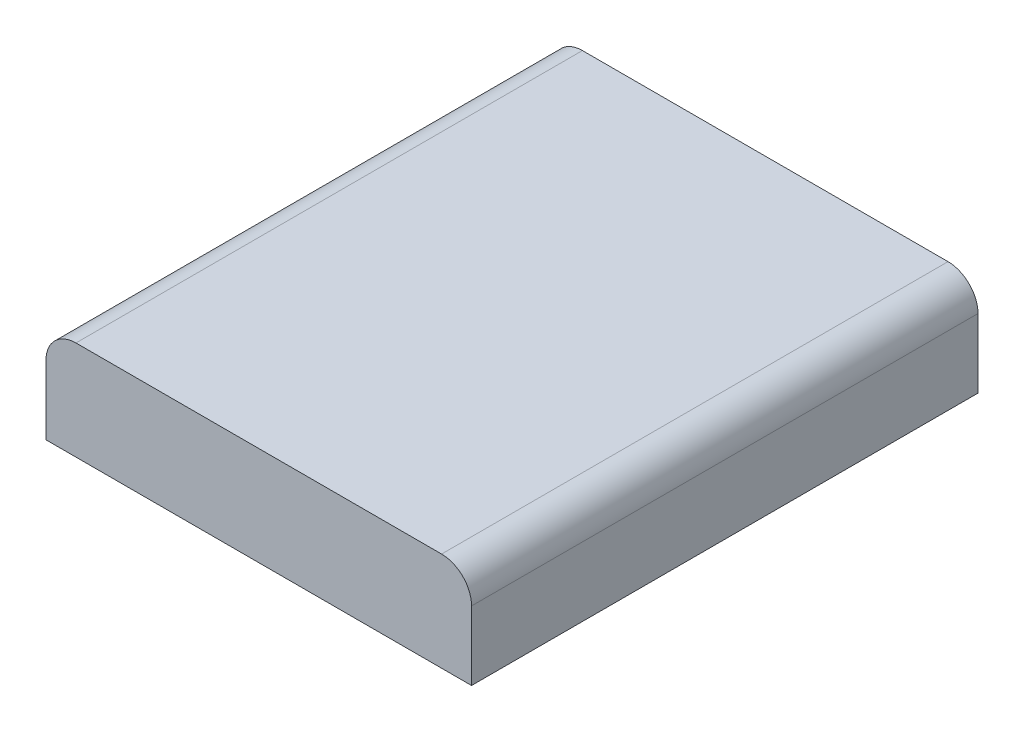
ISO-10303-21;
HEADER;
FILE_DESCRIPTION(('STEP AP214'),'2;1');
FILE_NAME('part.step','',(''),(''),'','','');
FILE_SCHEMA(('AUTOMOTIVE_DESIGN { 1 0 10303 214 1 1 1 1 }'));
ENDSEC;
DATA;
#1=APPLICATION_CONTEXT('core data for automotive mechanical design processes');
#2=APPLICATION_PROTOCOL_DEFINITION('international standard','automotive_design',2000,#1);
#3=PRODUCT_CONTEXT('',#1,'mechanical');
#4=PRODUCT('Part','Part','',(#3));
#5=PRODUCT_RELATED_PRODUCT_CATEGORY('part','',(#4));
#6=PRODUCT_DEFINITION_FORMATION('','',#4);
#7=PRODUCT_DEFINITION_CONTEXT('part definition',#1,'design');
#8=PRODUCT_DEFINITION('design','',#6,#7);
#9=PRODUCT_DEFINITION_SHAPE('','',#8);
#10=(LENGTH_UNIT() NAMED_UNIT(*) SI_UNIT(.MILLI.,.METRE.));
#11=(NAMED_UNIT(*) PLANE_ANGLE_UNIT() SI_UNIT($,.RADIAN.));
#12=(NAMED_UNIT(*) SI_UNIT($,.STERADIAN.) SOLID_ANGLE_UNIT());
#13=UNCERTAINTY_MEASURE_WITH_UNIT(LENGTH_MEASURE(1.E-05),#10,'distance_accuracy_value','');
#14=(GEOMETRIC_REPRESENTATION_CONTEXT(3) GLOBAL_UNCERTAINTY_ASSIGNED_CONTEXT((#13)) GLOBAL_UNIT_ASSIGNED_CONTEXT((#10,
#11,#12)) REPRESENTATION_CONTEXT('',''));
#15=CARTESIAN_POINT('',(0.,0.,0.));
#16=DIRECTION('',(0.,0.,1.));
#17=DIRECTION('',(1.,0.,0.));
#18=AXIS2_PLACEMENT_3D('',#15,#16,#17);
#19=CARTESIAN_POINT('',(0.,0.,169.));
#20=DIRECTION('',(1.,0.,0.));
#21=DIRECTION('',(0.,0.,-1.));
#22=AXIS2_PLACEMENT_3D('',#19,#20,#21);
#23=PLANE('',#22);
#24=DIRECTION('',(0.,-1.,0.));
#25=VECTOR('',#24,1.);
#26=CARTESIAN_POINT('',(0.,0.,0.));
#27=LINE('',#26,#25);
#28=CARTESIAN_POINT('',(0.,22.9999999999999,0.));
#29=VERTEX_POINT('',#28);
#30=CARTESIAN_POINT('',(0.,0.,0.));
#31=VERTEX_POINT('',#30);
#32=EDGE_CURVE('E123',#29,#31,#27,.T.);
#33=ORIENTED_EDGE('',*,*,#32,.T.);
#34=DIRECTION('',(0.,0.,-1.));
#35=VECTOR('',#34,1.);
#36=CARTESIAN_POINT('',(0.,0.,169.));
#37=LINE('',#36,#35);
#38=CARTESIAN_POINT('',(0.,0.,169.));
#39=VERTEX_POINT('',#38);
#40=EDGE_CURVE('E11',#39,#31,#37,.T.);
#41=ORIENTED_EDGE('',*,*,#40,.F.);
#42=DIRECTION('',(0.,-1.,0.));
#43=VECTOR('',#42,1.);
#44=CARTESIAN_POINT('',(0.,0.,169.));
#45=LINE('',#44,#43);
#46=CARTESIAN_POINT('',(0.,22.9999999999999,169.));
#47=VERTEX_POINT('',#46);
#48=EDGE_CURVE('E134',#47,#39,#45,.T.);
#49=ORIENTED_EDGE('',*,*,#48,.F.);
#50=DIRECTION('',(0.,0.,-1.));
#51=VECTOR('',#50,1.);
#52=CARTESIAN_POINT('',(0.,22.9999999999999,169.));
#53=LINE('',#52,#51);
#54=EDGE_CURVE('E122',#47,#29,#53,.T.);
#55=ORIENTED_EDGE('',*,*,#54,.T.);
#56=EDGE_LOOP('',(#33,#41,#49,#55));
#57=FACE_BOUND('',#56,.T.);
#58=ADVANCED_FACE('F41',(#57),#23,.F.);
#59=CARTESIAN_POINT('',(0.,0.,169.));
#60=DIRECTION('',(0.,1.,0.));
#61=DIRECTION('',(0.,0.,1.));
#62=AXIS2_PLACEMENT_3D('',#59,#60,#61);
#63=PLANE('',#62);
#64=DIRECTION('',(1.,0.,0.));
#65=VECTOR('',#64,1.);
#66=CARTESIAN_POINT('',(0.,0.,0.));
#67=LINE('',#66,#65);
#68=CARTESIAN_POINT('',(142.,0.,0.));
#69=VERTEX_POINT('',#68);
#70=EDGE_CURVE('E126',#31,#69,#67,.T.);
#71=ORIENTED_EDGE('',*,*,#70,.T.);
#72=DIRECTION('',(0.,0.,-1.));
#73=VECTOR('',#72,1.);
#74=CARTESIAN_POINT('',(142.,0.,169.));
#75=LINE('',#74,#73);
#76=CARTESIAN_POINT('',(142.,0.,169.));
#77=VERTEX_POINT('',#76);
#78=EDGE_CURVE('E47',#77,#69,#75,.T.);
#79=ORIENTED_EDGE('',*,*,#78,.F.);
#80=DIRECTION('',(1.,0.,0.));
#81=VECTOR('',#80,1.);
#82=CARTESIAN_POINT('',(0.,0.,169.));
#83=LINE('',#82,#81);
#84=EDGE_CURVE('E94',#39,#77,#83,.T.);
#85=ORIENTED_EDGE('',*,*,#84,.F.);
#86=ORIENTED_EDGE('',*,*,#40,.T.);
#87=EDGE_LOOP('',(#71,#79,#85,#86));
#88=FACE_BOUND('',#87,.T.);
#89=ADVANCED_FACE('F157',(#88),#63,.F.);
#90=CARTESIAN_POINT('',(142.,0.,169.));
#91=DIRECTION('',(-1.,0.,0.));
#92=DIRECTION('',(0.,0.,1.));
#93=AXIS2_PLACEMENT_3D('',#90,#91,#92);
#94=PLANE('',#93);
#95=DIRECTION('',(0.,1.,0.));
#96=VECTOR('',#95,1.);
#97=CARTESIAN_POINT('',(142.,0.,0.));
#98=LINE('',#97,#96);
#99=CARTESIAN_POINT('',(142.,22.9999999999999,0.));
#100=VERTEX_POINT('',#99);
#101=EDGE_CURVE('E128',#69,#100,#98,.T.);
#102=ORIENTED_EDGE('',*,*,#101,.T.);
#103=DIRECTION('',(0.,0.,-1.));
#104=VECTOR('',#103,1.);
#105=CARTESIAN_POINT('',(142.,22.9999999999999,169.));
#106=LINE('',#105,#104);
#107=CARTESIAN_POINT('',(142.,22.9999999999999,169.));
#108=VERTEX_POINT('',#107);
#109=EDGE_CURVE('E116',#108,#100,#106,.T.);
#110=ORIENTED_EDGE('',*,*,#109,.F.);
#111=DIRECTION('',(0.,1.,0.));
#112=VECTOR('',#111,1.);
#113=CARTESIAN_POINT('',(142.,0.,169.));
#114=LINE('',#113,#112);
#115=EDGE_CURVE('E110',#77,#108,#114,.T.);
#116=ORIENTED_EDGE('',*,*,#115,.F.);
#117=ORIENTED_EDGE('',*,*,#78,.T.);
#118=EDGE_LOOP('',(#102,#110,#116,#117));
#119=FACE_BOUND('',#118,.T.);
#120=ADVANCED_FACE('F143',(#119),#94,.F.);
#121=CARTESIAN_POINT('',(132.,23.,169.));
#122=DIRECTION('',(0.,0.,-1.));
#123=DIRECTION('',(-1.,0.,0.));
#124=AXIS2_PLACEMENT_3D('',#121,#122,#123);
#125=CYLINDRICAL_SURFACE('',#124,10.);
#126=CARTESIAN_POINT('',(132.,23.,0.));
#127=DIRECTION('',(0.,0.,1.));
#128=DIRECTION('',(1.,0.,0.));
#129=AXIS2_PLACEMENT_3D('',#126,#127,#128);
#130=CIRCLE('',#129,10.);
#131=CARTESIAN_POINT('',(132.,33.,0.));
#132=VERTEX_POINT('',#131);
#133=EDGE_CURVE('E113',#100,#132,#130,.T.);
#134=ORIENTED_EDGE('',*,*,#133,.T.);
#135=DIRECTION('',(0.,0.,-1.));
#136=VECTOR('',#135,1.);
#137=CARTESIAN_POINT('',(132.,33.,169.));
#138=LINE('',#137,#136);
#139=CARTESIAN_POINT('',(132.,33.,169.));
#140=VERTEX_POINT('',#139);
#141=EDGE_CURVE('E115',#140,#132,#138,.T.);
#142=ORIENTED_EDGE('',*,*,#141,.F.);
#143=CARTESIAN_POINT('',(132.,23.,169.));
#144=DIRECTION('',(0.,0.,1.));
#145=DIRECTION('',(1.,0.,0.));
#146=AXIS2_PLACEMENT_3D('',#143,#144,#145);
#147=CIRCLE('',#146,10.);
#148=EDGE_CURVE('E101',#108,#140,#147,.T.);
#149=ORIENTED_EDGE('',*,*,#148,.F.);
#150=ORIENTED_EDGE('',*,*,#109,.T.);
#151=EDGE_LOOP('',(#134,#142,#149,#150));
#152=FACE_BOUND('',#151,.T.);
#153=ADVANCED_FACE('F114',(#152),#125,.T.);
#154=CARTESIAN_POINT('',(10.0000000000001,33.,169.));
#155=DIRECTION('',(0.,-1.,0.));
#156=DIRECTION('',(0.,0.,-1.));
#157=AXIS2_PLACEMENT_3D('',#154,#155,#156);
#158=PLANE('',#157);
#159=DIRECTION('',(-1.,0.,0.));
#160=VECTOR('',#159,1.);
#161=CARTESIAN_POINT('',(10.0000000000001,33.,0.));
#162=LINE('',#161,#160);
#163=CARTESIAN_POINT('',(10.0000000000001,33.,0.));
#164=VERTEX_POINT('',#163);
#165=EDGE_CURVE('E79',#132,#164,#162,.T.);
#166=ORIENTED_EDGE('',*,*,#165,.T.);
#167=DIRECTION('',(0.,0.,-1.));
#168=VECTOR('',#167,1.);
#169=CARTESIAN_POINT('',(10.0000000000001,33.,169.));
#170=LINE('',#169,#168);
#171=CARTESIAN_POINT('',(10.0000000000001,33.,169.));
#172=VERTEX_POINT('',#171);
#173=EDGE_CURVE('E120',#172,#164,#170,.T.);
#174=ORIENTED_EDGE('',*,*,#173,.F.);
#175=DIRECTION('',(-1.,0.,0.));
#176=VECTOR('',#175,1.);
#177=CARTESIAN_POINT('',(10.0000000000001,33.,169.));
#178=LINE('',#177,#176);
#179=EDGE_CURVE('E104',#140,#172,#178,.T.);
#180=ORIENTED_EDGE('',*,*,#179,.F.);
#181=ORIENTED_EDGE('',*,*,#141,.T.);
#182=EDGE_LOOP('',(#166,#174,#180,#181));
#183=FACE_BOUND('',#182,.T.);
#184=ADVANCED_FACE('F118',(#183),#158,.F.);
#185=CARTESIAN_POINT('',(10.,23.,169.));
#186=DIRECTION('',(0.,0.,-1.));
#187=DIRECTION('',(-1.,0.,0.));
#188=AXIS2_PLACEMENT_3D('',#185,#186,#187);
#189=CYLINDRICAL_SURFACE('',#188,10.);
#190=CARTESIAN_POINT('',(10.,23.,0.));
#191=DIRECTION('',(0.,0.,1.));
#192=DIRECTION('',(1.,0.,0.));
#193=AXIS2_PLACEMENT_3D('',#190,#191,#192);
#194=CIRCLE('',#193,10.);
#195=EDGE_CURVE('E88',#164,#29,#194,.T.);
#196=ORIENTED_EDGE('',*,*,#195,.T.);
#197=ORIENTED_EDGE('',*,*,#54,.F.);
#198=CARTESIAN_POINT('',(10.,23.,169.));
#199=DIRECTION('',(0.,0.,1.));
#200=DIRECTION('',(1.,0.,0.));
#201=AXIS2_PLACEMENT_3D('',#198,#199,#200);
#202=CIRCLE('',#201,10.);
#203=EDGE_CURVE('E60',#172,#47,#202,.T.);
#204=ORIENTED_EDGE('',*,*,#203,.F.);
#205=ORIENTED_EDGE('',*,*,#173,.T.);
#206=EDGE_LOOP('',(#196,#197,#204,#205));
#207=FACE_BOUND('',#206,.T.);
#208=ADVANCED_FACE('F146',(#207),#189,.T.);
#209=CARTESIAN_POINT('',(10.,23.,169.));
#210=DIRECTION('',(0.,0.,1.));
#211=DIRECTION('',(1.,0.,0.));
#212=AXIS2_PLACEMENT_3D('',#209,#210,#211);
#213=PLANE('',#212);
#214=ORIENTED_EDGE('',*,*,#48,.T.);
#215=ORIENTED_EDGE('',*,*,#84,.T.);
#216=ORIENTED_EDGE('',*,*,#115,.T.);
#217=ORIENTED_EDGE('',*,*,#148,.T.);
#218=ORIENTED_EDGE('',*,*,#179,.T.);
#219=ORIENTED_EDGE('',*,*,#203,.T.);
#220=EDGE_LOOP('',(#214,#215,#216,#217,#218,#219));
#221=FACE_BOUND('',#220,.T.);
#222=ADVANCED_FACE('F103',(#221),#213,.T.);
#223=CARTESIAN_POINT('',(10.,23.,0.));
#224=DIRECTION('',(0.,0.,1.));
#225=DIRECTION('',(1.,0.,0.));
#226=AXIS2_PLACEMENT_3D('',#223,#224,#225);
#227=PLANE('',#226);
#228=ORIENTED_EDGE('',*,*,#32,.F.);
#229=ORIENTED_EDGE('',*,*,#195,.F.);
#230=ORIENTED_EDGE('',*,*,#165,.F.);
#231=ORIENTED_EDGE('',*,*,#133,.F.);
#232=ORIENTED_EDGE('',*,*,#101,.F.);
#233=ORIENTED_EDGE('',*,*,#70,.F.);
#234=EDGE_LOOP('',(#228,#229,#230,#231,#232,#233));
#235=FACE_BOUND('',#234,.T.);
#236=ADVANCED_FACE('F145',(#235),#227,.F.);
#237=CLOSED_SHELL('',(#58,#89,#120,#153,#184,#208,#222,#236));
#238=MANIFOLD_SOLID_BREP('B2',#237);
#239=ADVANCED_BREP_SHAPE_REPRESENTATION('',(#18,#238),#14);
#240=SHAPE_DEFINITION_REPRESENTATION(#9,#239);
ENDSEC;
END-ISO-10303-21;
